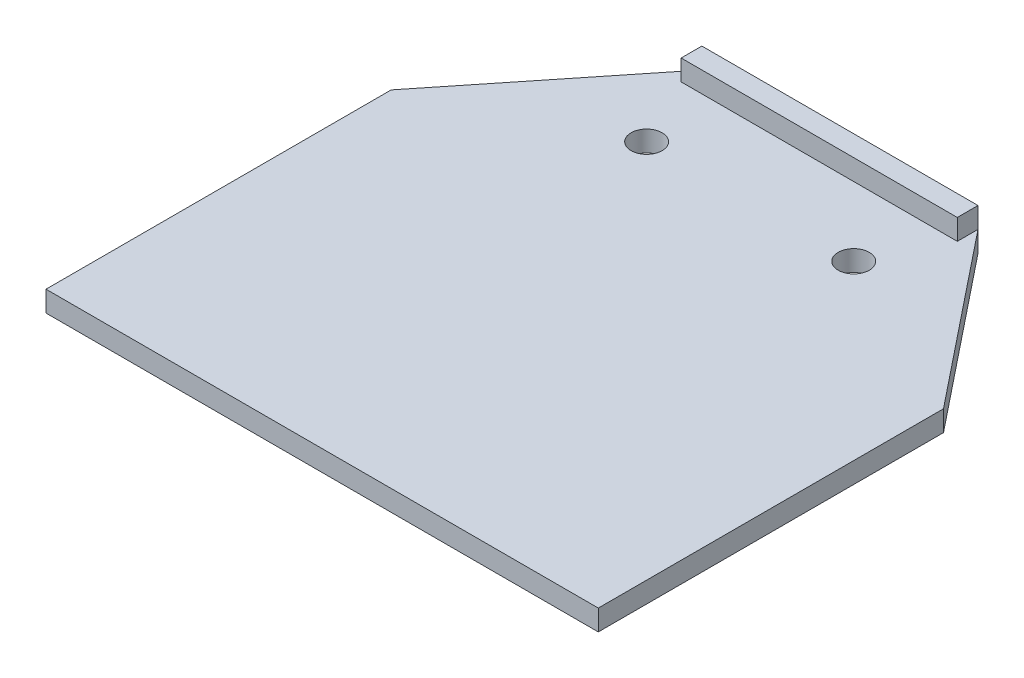
ISO-10303-21;
HEADER;
FILE_DESCRIPTION(('STEP AP214'),'2;1');
FILE_NAME('part.step','',(''),(''),'','','');
FILE_SCHEMA(('AUTOMOTIVE_DESIGN { 1 0 10303 214 1 1 1 1 }'));
ENDSEC;
DATA;
#1=APPLICATION_CONTEXT('core data for automotive mechanical design processes');
#2=APPLICATION_PROTOCOL_DEFINITION('international standard','automotive_design',2000,#1);
#3=PRODUCT_CONTEXT('',#1,'mechanical');
#4=PRODUCT('Part','Part','',(#3));
#5=PRODUCT_RELATED_PRODUCT_CATEGORY('part','',(#4));
#6=PRODUCT_DEFINITION_FORMATION('','',#4);
#7=PRODUCT_DEFINITION_CONTEXT('part definition',#1,'design');
#8=PRODUCT_DEFINITION('design','',#6,#7);
#9=PRODUCT_DEFINITION_SHAPE('','',#8);
#10=(LENGTH_UNIT() NAMED_UNIT(*) SI_UNIT(.MILLI.,.METRE.));
#11=(NAMED_UNIT(*) PLANE_ANGLE_UNIT() SI_UNIT($,.RADIAN.));
#12=(NAMED_UNIT(*) SI_UNIT($,.STERADIAN.) SOLID_ANGLE_UNIT());
#13=UNCERTAINTY_MEASURE_WITH_UNIT(LENGTH_MEASURE(1.E-05),#10,'distance_accuracy_value','');
#14=(GEOMETRIC_REPRESENTATION_CONTEXT(3) GLOBAL_UNCERTAINTY_ASSIGNED_CONTEXT((#13)) GLOBAL_UNIT_ASSIGNED_CONTEXT((#10,
#11,#12)) REPRESENTATION_CONTEXT('',''));
#15=CARTESIAN_POINT('',(0.,0.,0.));
#16=DIRECTION('',(0.,0.,1.));
#17=DIRECTION('',(1.,0.,0.));
#18=AXIS2_PLACEMENT_3D('',#15,#16,#17);
#19=CARTESIAN_POINT('',(-35.71281292086,25.,-150.0000000003));
#20=DIRECTION('',(-0.780868809443226,0.,-0.62469504755418));
#21=DIRECTION('',(-0.62469504755418,0.,0.780868809443226));
#22=AXIS2_PLACEMENT_3D('',#19,#20,#21);
#23=PLANE('',#22);
#24=DIRECTION('',(-0.62469504755418,0.,0.780868809443226));
#25=VECTOR('',#24,1.);
#26=CARTESIAN_POINT('',(-35.71281292086,25.,-150.0000000003));
#27=LINE('',#26,#25);
#28=CARTESIAN_POINT('',(-35.71281292086,25.,-150.0000000003));
#29=VERTEX_POINT('',#28);
#30=CARTESIAN_POINT('',(-75.71281292094,25.,-99.99999999991));
#31=VERTEX_POINT('',#30);
#32=EDGE_CURVE('E243',#29,#31,#27,.T.);
#33=ORIENTED_EDGE('',*,*,#32,.T.);
#34=DIRECTION('',(0.,1.,0.));
#35=VECTOR('',#34,1.);
#36=CARTESIAN_POINT('',(-75.71281292094,25.,-99.99999999991));
#37=LINE('',#36,#35);
#38=CARTESIAN_POINT('',(-75.71281292094,31.,-99.99999999991));
#39=VERTEX_POINT('',#38);
#40=EDGE_CURVE('E241',#31,#39,#37,.T.);
#41=ORIENTED_EDGE('',*,*,#40,.T.);
#42=DIRECTION('',(-0.62469504755418,0.,0.780868809443226));
#43=VECTOR('',#42,1.);
#44=CARTESIAN_POINT('',(-35.71281292086,31.,-150.0000000003));
#45=LINE('',#44,#43);
#46=CARTESIAN_POINT('',(-35.71281292086,31.,-150.0000000003));
#47=VERTEX_POINT('',#46);
#48=EDGE_CURVE('E11',#47,#39,#45,.T.);
#49=ORIENTED_EDGE('',*,*,#48,.F.);
#50=DIRECTION('',(0.,1.,0.));
#51=VECTOR('',#50,1.);
#52=CARTESIAN_POINT('',(-35.71281292086,25.,-150.0000000003));
#53=LINE('',#52,#51);
#54=EDGE_CURVE('E130',#29,#47,#53,.T.);
#55=ORIENTED_EDGE('',*,*,#54,.F.);
#56=EDGE_LOOP('',(#33,#41,#49,#55));
#57=FACE_BOUND('',#56,.T.);
#58=ADVANCED_FACE('F17',(#57),#23,.T.);
#59=CARTESIAN_POINT('',(4.287187079,31.,-87.70969277747));
#60=DIRECTION('',(0.,-1.,0.));
#61=DIRECTION('',(-1.,0.,0.));
#62=AXIS2_PLACEMENT_3D('',#59,#60,#61);
#63=PLANE('',#62);
#64=CARTESIAN_POINT('',(34.287187078966,31.,-123.9999999997));
#65=DIRECTION('',(0.,1.,0.));
#66=DIRECTION('',(1.,0.,-4.806710585115E-13));
#67=AXIS2_PLACEMENT_3D('',#64,#65,#66);
#68=CIRCLE('',#67,4.5);
#69=CARTESIAN_POINT('',(38.787187078975,31.,-123.9999999997));
#70=VERTEX_POINT('',#69);
#71=EDGE_CURVE('E117',#70,#70,#68,.T.);
#72=ORIENTED_EDGE('',*,*,#71,.F.);
#73=EDGE_LOOP('',(#72));
#74=FACE_BOUND('',#73,.T.);
#75=CARTESIAN_POINT('',(-25.71281292095,31.,-123.9999999998));
#76=DIRECTION('',(0.,1.,0.));
#77=DIRECTION('',(1.,0.,-4.806710585115E-13));
#78=AXIS2_PLACEMENT_3D('',#75,#76,#77);
#79=CIRCLE('',#78,4.5);
#80=CARTESIAN_POINT('',(-21.21281292094,31.,-123.9999999998));
#81=VERTEX_POINT('',#80);
#82=EDGE_CURVE('E126',#81,#81,#79,.T.);
#83=ORIENTED_EDGE('',*,*,#82,.F.);
#84=EDGE_LOOP('',(#83));
#85=FACE_BOUND('',#84,.T.);
#86=ORIENTED_EDGE('',*,*,#48,.T.);
#87=DIRECTION('',(4.806710585115E-13,0.,1.));
#88=VECTOR('',#87,1.);
#89=CARTESIAN_POINT('',(-75.71281292094,31.,-99.99999999991));
#90=LINE('',#89,#88);
#91=CARTESIAN_POINT('',(-75.71281292092,31.,-70.));
#92=VERTEX_POINT('',#91);
#93=EDGE_CURVE('E238',#39,#92,#90,.T.);
#94=ORIENTED_EDGE('',*,*,#93,.T.);
#95=DIRECTION('',(3.591571484662E-13,0.,1.));
#96=VECTOR('',#95,1.);
#97=CARTESIAN_POINT('',(-75.71281292092,31.,-70.));
#98=LINE('',#97,#96);
#99=CARTESIAN_POINT('',(-75.7128129209,31.,-2.605702320579E-10));
#100=VERTEX_POINT('',#99);
#101=EDGE_CURVE('E251',#92,#100,#98,.T.);
#102=ORIENTED_EDGE('',*,*,#101,.T.);
#103=DIRECTION('',(1.,0.,-4.806710585115E-13));
#104=VECTOR('',#103,1.);
#105=CARTESIAN_POINT('',(-75.7128129209,31.,-2.596607373562E-10));
#106=LINE('',#105,#104);
#107=CARTESIAN_POINT('',(84.28718707904,31.,1.423359208275E-10));
#108=VERTEX_POINT('',#107);
#109=EDGE_CURVE('E28',#100,#108,#106,.T.);
#110=ORIENTED_EDGE('',*,*,#109,.T.);
#111=DIRECTION('',(1.361966095459E-12,0.,1.));
#112=VECTOR('',#111,1.);
#113=CARTESIAN_POINT('',(84.287187078904,31.,-99.99999999953));
#114=LINE('',#113,#112);
#115=CARTESIAN_POINT('',(84.287187078904,31.,-99.99999999953));
#116=VERTEX_POINT('',#115);
#117=EDGE_CURVE('E21',#116,#108,#114,.T.);
#118=ORIENTED_EDGE('',*,*,#117,.F.);
#119=DIRECTION('',(-0.62469504755479,0.,-0.780868809442738));
#120=VECTOR('',#119,1.);
#121=CARTESIAN_POINT('',(84.287187078904,31.,-99.99999999953));
#122=LINE('',#121,#120);
#123=CARTESIAN_POINT('',(44.287187079157,31.,-150.0000000001));
#124=VERTEX_POINT('',#123);
#125=EDGE_CURVE('E150',#116,#124,#122,.T.);
#126=ORIENTED_EDGE('',*,*,#125,.T.);
#127=DIRECTION('',(4.806710585115E-13,0.,1.));
#128=VECTOR('',#127,1.);
#129=CARTESIAN_POINT('',(44.287187079157,31.,-150.0000000001));
#130=LINE('',#129,#128);
#131=CARTESIAN_POINT('',(44.287187079074,31.,-143.9999999998));
#132=VERTEX_POINT('',#131);
#133=EDGE_CURVE('E83',#124,#132,#130,.T.);
#134=ORIENTED_EDGE('',*,*,#133,.T.);
#135=DIRECTION('',(1.,0.,-4.806710585115E-13));
#136=VECTOR('',#135,1.);
#137=CARTESIAN_POINT('',(-35.71281292094,31.,-144.0000000001));
#138=LINE('',#137,#136);
#139=CARTESIAN_POINT('',(-35.71281292094,31.,-144.0000000001));
#140=VERTEX_POINT('',#139);
#141=EDGE_CURVE('E96',#140,#132,#138,.T.);
#142=ORIENTED_EDGE('',*,*,#141,.F.);
#143=DIRECTION('',(4.806710585115E-13,0.,1.));
#144=VECTOR('',#143,1.);
#145=CARTESIAN_POINT('',(-35.71281292086,31.,-150.0000000003));
#146=LINE('',#145,#144);
#147=EDGE_CURVE('E115',#47,#140,#146,.T.);
#148=ORIENTED_EDGE('',*,*,#147,.F.);
#149=EDGE_LOOP('',(#86,#94,#102,#110,#118,#126,#134,#142,#148));
#150=FACE_BOUND('',#149,.T.);
#151=ADVANCED_FACE('F167',(#74,#85,#150),#63,.F.);
#152=CARTESIAN_POINT('',(-75.7128129209,25.,-2.596607373562E-10));
#153=DIRECTION('',(4.806710585115E-13,0.,1.));
#154=DIRECTION('',(1.,0.,-4.806710585115E-13));
#155=AXIS2_PLACEMENT_3D('',#152,#153,#154);
#156=PLANE('',#155);
#157=DIRECTION('',(1.,0.,-4.806710585115E-13));
#158=VECTOR('',#157,1.);
#159=CARTESIAN_POINT('',(-75.7128129209,25.,-2.596607373562E-10));
#160=LINE('',#159,#158);
#161=CARTESIAN_POINT('',(-75.7128129209,25.,-2.605702320579E-10));
#162=VERTEX_POINT('',#161);
#163=CARTESIAN_POINT('',(84.28718707904,25.,1.423359208275E-10));
#164=VERTEX_POINT('',#163);
#165=EDGE_CURVE('E112',#162,#164,#160,.T.);
#166=ORIENTED_EDGE('',*,*,#165,.T.);
#167=DIRECTION('',(0.,1.,0.));
#168=VECTOR('',#167,1.);
#169=CARTESIAN_POINT('',(84.28718707904,25.,1.418811734766E-10));
#170=LINE('',#169,#168);
#171=EDGE_CURVE('E123',#164,#108,#170,.T.);
#172=ORIENTED_EDGE('',*,*,#171,.T.);
#173=ORIENTED_EDGE('',*,*,#109,.F.);
#174=DIRECTION('',(0.,1.,0.));
#175=VECTOR('',#174,1.);
#176=CARTESIAN_POINT('',(-75.7128129209,25.,-2.596607373562E-10));
#177=LINE('',#176,#175);
#178=EDGE_CURVE('E256',#162,#100,#177,.T.);
#179=ORIENTED_EDGE('',*,*,#178,.F.);
#180=EDGE_LOOP('',(#166,#172,#173,#179));
#181=FACE_BOUND('',#180,.T.);
#182=ADVANCED_FACE('F292',(#181),#156,.T.);
#183=CARTESIAN_POINT('',(84.28718707904,25.,-39.99999999985));
#184=DIRECTION('',(1.,0.,-4.806988140871E-13));
#185=DIRECTION('',(-4.806988140871E-13,0.,-1.));
#186=AXIS2_PLACEMENT_3D('',#183,#184,#185);
#187=PLANE('',#186);
#188=DIRECTION('',(0.,1.,0.));
#189=VECTOR('',#188,1.);
#190=CARTESIAN_POINT('',(84.287187078904,25.,-99.99999999953));
#191=LINE('',#190,#189);
#192=CARTESIAN_POINT('',(84.287187078904,25.,-99.99999999953));
#193=VERTEX_POINT('',#192);
#194=EDGE_CURVE('E152',#193,#116,#191,.T.);
#195=ORIENTED_EDGE('',*,*,#194,.T.);
#196=ORIENTED_EDGE('',*,*,#117,.T.);
#197=ORIENTED_EDGE('',*,*,#171,.F.);
#198=DIRECTION('',(-1.361966095459E-12,0.,-1.));
#199=VECTOR('',#198,1.);
#200=CARTESIAN_POINT('',(84.28718707904,25.,1.419948603143E-10));
#201=LINE('',#200,#199);
#202=EDGE_CURVE('E271',#164,#193,#201,.T.);
#203=ORIENTED_EDGE('',*,*,#202,.T.);
#204=EDGE_LOOP('',(#195,#196,#197,#203));
#205=FACE_BOUND('',#204,.T.);
#206=ADVANCED_FACE('F19',(#205),#187,.T.);
#207=CARTESIAN_POINT('',(84.287187078904,25.,-99.99999999953));
#208=DIRECTION('',(0.780868809442738,0.,-0.62469504755479));
#209=DIRECTION('',(0.,-1.,0.));
#210=AXIS2_PLACEMENT_3D('',#207,#208,#209);
#211=PLANE('',#210);
#212=DIRECTION('',(-0.62469504755479,0.,-0.780868809442738));
#213=VECTOR('',#212,1.);
#214=CARTESIAN_POINT('',(84.287187078904,25.,-99.99999999953));
#215=LINE('',#214,#213);
#216=CARTESIAN_POINT('',(44.287187079157,25.,-150.0000000001));
#217=VERTEX_POINT('',#216);
#218=EDGE_CURVE('E174',#193,#217,#215,.T.);
#219=ORIENTED_EDGE('',*,*,#218,.T.);
#220=DIRECTION('',(0.,1.,0.));
#221=VECTOR('',#220,1.);
#222=CARTESIAN_POINT('',(44.287187079157,25.,-150.0000000001));
#223=LINE('',#222,#221);
#224=EDGE_CURVE('E116',#217,#124,#223,.T.);
#225=ORIENTED_EDGE('',*,*,#224,.T.);
#226=ORIENTED_EDGE('',*,*,#125,.F.);
#227=ORIENTED_EDGE('',*,*,#194,.F.);
#228=EDGE_LOOP('',(#219,#225,#226,#227));
#229=FACE_BOUND('',#228,.T.);
#230=ADVANCED_FACE('F171',(#229),#211,.T.);
#231=CARTESIAN_POINT('',(44.287187079157,37.,-150.0000000001));
#232=DIRECTION('',(1.,0.,-4.806710585115E-13));
#233=DIRECTION('',(-4.806710585115E-13,0.,-1.));
#234=AXIS2_PLACEMENT_3D('',#231,#232,#233);
#235=PLANE('',#234);
#236=DIRECTION('',(0.,-1.,0.));
#237=VECTOR('',#236,1.);
#238=CARTESIAN_POINT('',(44.287187079074,37.,-143.9999999998));
#239=LINE('',#238,#237);
#240=CARTESIAN_POINT('',(44.287187079074,37.,-143.9999999998));
#241=VERTEX_POINT('',#240);
#242=EDGE_CURVE('E75',#241,#132,#239,.T.);
#243=ORIENTED_EDGE('',*,*,#242,.T.);
#244=ORIENTED_EDGE('',*,*,#133,.F.);
#245=DIRECTION('',(0.,-1.,0.));
#246=VECTOR('',#245,1.);
#247=CARTESIAN_POINT('',(44.287187079157,37.,-150.0000000001));
#248=LINE('',#247,#246);
#249=CARTESIAN_POINT('',(44.287187079157,37.,-150.0000000001));
#250=VERTEX_POINT('',#249);
#251=EDGE_CURVE('E78',#250,#124,#248,.T.);
#252=ORIENTED_EDGE('',*,*,#251,.F.);
#253=DIRECTION('',(4.806710585115E-13,0.,1.));
#254=VECTOR('',#253,1.);
#255=CARTESIAN_POINT('',(44.287187079157,37.,-150.0000000001));
#256=LINE('',#255,#254);
#257=EDGE_CURVE('E70',#250,#241,#256,.T.);
#258=ORIENTED_EDGE('',*,*,#257,.T.);
#259=EDGE_LOOP('',(#243,#244,#252,#258));
#260=FACE_BOUND('',#259,.T.);
#261=ADVANCED_FACE('F72',(#260),#235,.T.);
#262=CARTESIAN_POINT('',(-35.71281292086,37.,-150.0000000003));
#263=DIRECTION('',(0.,-1.,0.));
#264=DIRECTION('',(-1.,0.,0.));
#265=AXIS2_PLACEMENT_3D('',#262,#263,#264);
#266=PLANE('',#265);
#267=DIRECTION('',(1.,0.,-4.806710585115E-13));
#268=VECTOR('',#267,1.);
#269=CARTESIAN_POINT('',(-35.71281292086,37.,-150.0000000003));
#270=LINE('',#269,#268);
#271=CARTESIAN_POINT('',(-35.71281292086,37.,-150.0000000003));
#272=VERTEX_POINT('',#271);
#273=EDGE_CURVE('E135',#272,#250,#270,.T.);
#274=ORIENTED_EDGE('',*,*,#273,.F.);
#275=DIRECTION('',(4.806710585115E-13,0.,1.));
#276=VECTOR('',#275,1.);
#277=CARTESIAN_POINT('',(-35.71281292086,37.,-150.0000000003));
#278=LINE('',#277,#276);
#279=CARTESIAN_POINT('',(-35.71281292094,37.,-144.0000000001));
#280=VERTEX_POINT('',#279);
#281=EDGE_CURVE('E89',#272,#280,#278,.T.);
#282=ORIENTED_EDGE('',*,*,#281,.T.);
#283=DIRECTION('',(1.,0.,-4.806710585115E-13));
#284=VECTOR('',#283,1.);
#285=CARTESIAN_POINT('',(-35.71281292094,37.,-144.0000000001));
#286=LINE('',#285,#284);
#287=EDGE_CURVE('E84',#280,#241,#286,.T.);
#288=ORIENTED_EDGE('',*,*,#287,.T.);
#289=ORIENTED_EDGE('',*,*,#257,.F.);
#290=EDGE_LOOP('',(#274,#282,#288,#289));
#291=FACE_BOUND('',#290,.T.);
#292=ADVANCED_FACE('F87',(#291),#266,.F.);
#293=CARTESIAN_POINT('',(-35.71281292094,37.,-144.0000000001));
#294=DIRECTION('',(4.806710585115E-13,0.,1.));
#295=DIRECTION('',(1.,0.,-4.806710585115E-13));
#296=AXIS2_PLACEMENT_3D('',#293,#294,#295);
#297=PLANE('',#296);
#298=ORIENTED_EDGE('',*,*,#141,.T.);
#299=ORIENTED_EDGE('',*,*,#242,.F.);
#300=ORIENTED_EDGE('',*,*,#287,.F.);
#301=DIRECTION('',(0.,-1.,0.));
#302=VECTOR('',#301,1.);
#303=CARTESIAN_POINT('',(-35.71281292094,37.,-144.0000000001));
#304=LINE('',#303,#302);
#305=EDGE_CURVE('E103',#280,#140,#304,.T.);
#306=ORIENTED_EDGE('',*,*,#305,.T.);
#307=EDGE_LOOP('',(#298,#299,#300,#306));
#308=FACE_BOUND('',#307,.T.);
#309=ADVANCED_FACE('F95',(#308),#297,.T.);
#310=CARTESIAN_POINT('',(-35.71281292086,37.,-150.0000000003));
#311=DIRECTION('',(1.,0.,-4.806710585115E-13));
#312=DIRECTION('',(-4.806710585115E-13,0.,-1.));
#313=AXIS2_PLACEMENT_3D('',#310,#311,#312);
#314=PLANE('',#313);
#315=ORIENTED_EDGE('',*,*,#281,.F.);
#316=DIRECTION('',(0.,-1.,0.));
#317=VECTOR('',#316,1.);
#318=CARTESIAN_POINT('',(-35.71281292086,37.,-150.0000000003));
#319=LINE('',#318,#317);
#320=EDGE_CURVE('E134',#272,#47,#319,.T.);
#321=ORIENTED_EDGE('',*,*,#320,.T.);
#322=ORIENTED_EDGE('',*,*,#147,.T.);
#323=ORIENTED_EDGE('',*,*,#305,.F.);
#324=EDGE_LOOP('',(#315,#321,#322,#323));
#325=FACE_BOUND('',#324,.T.);
#326=ADVANCED_FACE('F321',(#325),#314,.F.);
#327=CARTESIAN_POINT('',(44.287187079157,25.,-150.0000000001));
#328=DIRECTION('',(-4.806710585115E-13,0.,-1.));
#329=DIRECTION('',(-1.,0.,4.806710585115E-13));
#330=AXIS2_PLACEMENT_3D('',#327,#328,#329);
#331=PLANE('',#330);
#332=DIRECTION('',(-1.,0.,4.806710585115E-13));
#333=VECTOR('',#332,1.);
#334=CARTESIAN_POINT('',(44.287187079157,25.,-150.0000000001));
#335=LINE('',#334,#333);
#336=EDGE_CURVE('E264',#217,#29,#335,.T.);
#337=ORIENTED_EDGE('',*,*,#336,.T.);
#338=ORIENTED_EDGE('',*,*,#54,.T.);
#339=ORIENTED_EDGE('',*,*,#320,.F.);
#340=ORIENTED_EDGE('',*,*,#273,.T.);
#341=ORIENTED_EDGE('',*,*,#251,.T.);
#342=ORIENTED_EDGE('',*,*,#224,.F.);
#343=EDGE_LOOP('',(#337,#338,#339,#340,#341,#342));
#344=FACE_BOUND('',#343,.T.);
#345=ADVANCED_FACE('F178',(#344),#331,.T.);
#346=CARTESIAN_POINT('',(-25.71281292095,24.99,-123.9999999998));
#347=DIRECTION('',(0.,-1.,0.));
#348=DIRECTION('',(1.,0.,-4.806710585115E-13));
#349=AXIS2_PLACEMENT_3D('',#346,#347,#348);
#350=CYLINDRICAL_SURFACE('',#349,4.5);
#351=DIRECTION('',(0.,1.,0.));
#352=VECTOR('',#351,1.);
#353=CARTESIAN_POINT('',(-21.21281292094,24.99,-123.9999999998));
#354=LINE('',#353,#352);
#355=CARTESIAN_POINT('',(-21.21281292094,25.,-123.9999999998));
#356=VERTEX_POINT('',#355);
#357=EDGE_CURVE('E121',#356,#81,#354,.T.);
#358=ORIENTED_EDGE('',*,*,#357,.T.);
#359=ORIENTED_EDGE('',*,*,#82,.T.);
#360=ORIENTED_EDGE('',*,*,#357,.F.);
#361=CARTESIAN_POINT('',(-25.71281292095,25.,-123.9999999998));
#362=DIRECTION('',(0.,1.,0.));
#363=DIRECTION('',(1.,0.,-4.806710585115E-13));
#364=AXIS2_PLACEMENT_3D('',#361,#362,#363);
#365=CIRCLE('',#364,4.5);
#366=EDGE_CURVE('E108',#356,#356,#365,.T.);
#367=ORIENTED_EDGE('',*,*,#366,.F.);
#368=EDGE_LOOP('',(#358,#359,#360,#367));
#369=FACE_BOUND('',#368,.T.);
#370=ADVANCED_FACE('F316',(#369),#350,.F.);
#371=CARTESIAN_POINT('',(34.287187078966,24.99,-123.9999999997));
#372=DIRECTION('',(0.,-1.,0.));
#373=DIRECTION('',(1.,0.,-4.806710585115E-13));
#374=AXIS2_PLACEMENT_3D('',#371,#372,#373);
#375=CYLINDRICAL_SURFACE('',#374,4.5);
#376=DIRECTION('',(0.,1.,0.));
#377=VECTOR('',#376,1.);
#378=CARTESIAN_POINT('',(38.787187078975,24.99,-123.9999999997));
#379=LINE('',#378,#377);
#380=CARTESIAN_POINT('',(38.787187078975,25.,-123.9999999997));
#381=VERTEX_POINT('',#380);
#382=EDGE_CURVE('E122',#381,#70,#379,.T.);
#383=ORIENTED_EDGE('',*,*,#382,.T.);
#384=ORIENTED_EDGE('',*,*,#71,.T.);
#385=ORIENTED_EDGE('',*,*,#382,.F.);
#386=CARTESIAN_POINT('',(34.287187078966,25.,-123.9999999997));
#387=DIRECTION('',(0.,1.,0.));
#388=DIRECTION('',(1.,0.,-4.806710585115E-13));
#389=AXIS2_PLACEMENT_3D('',#386,#387,#388);
#390=CIRCLE('',#389,4.5);
#391=EDGE_CURVE('E111',#381,#381,#390,.T.);
#392=ORIENTED_EDGE('',*,*,#391,.F.);
#393=EDGE_LOOP('',(#383,#384,#385,#392));
#394=FACE_BOUND('',#393,.T.);
#395=ADVANCED_FACE('F314',(#394),#375,.F.);
#396=CARTESIAN_POINT('',(4.287187079,25.,-87.70969277747));
#397=DIRECTION('',(0.,-1.,0.));
#398=DIRECTION('',(-1.,0.,0.));
#399=AXIS2_PLACEMENT_3D('',#396,#397,#398);
#400=PLANE('',#399);
#401=ORIENTED_EDGE('',*,*,#391,.T.);
#402=EDGE_LOOP('',(#401));
#403=FACE_BOUND('',#402,.T.);
#404=ORIENTED_EDGE('',*,*,#366,.T.);
#405=EDGE_LOOP('',(#404));
#406=FACE_BOUND('',#405,.T.);
#407=ORIENTED_EDGE('',*,*,#32,.F.);
#408=ORIENTED_EDGE('',*,*,#336,.F.);
#409=ORIENTED_EDGE('',*,*,#218,.F.);
#410=ORIENTED_EDGE('',*,*,#202,.F.);
#411=ORIENTED_EDGE('',*,*,#165,.F.);
#412=DIRECTION('',(-3.956279748252E-13,0.,-1.));
#413=VECTOR('',#412,1.);
#414=CARTESIAN_POINT('',(-75.7128129209,25.,-2.604565452202E-10));
#415=LINE('',#414,#413);
#416=EDGE_CURVE('E287',#162,#31,#415,.T.);
#417=ORIENTED_EDGE('',*,*,#416,.T.);
#418=EDGE_LOOP('',(#407,#408,#409,#410,#411,#417));
#419=FACE_BOUND('',#418,.T.);
#420=ADVANCED_FACE('F279',(#403,#406,#419),#400,.T.);
#421=CARTESIAN_POINT('',(-75.71281292094,25.,-99.99999999991));
#422=DIRECTION('',(-1.,0.,4.806988140871E-13));
#423=DIRECTION('',(0.,1.,0.));
#424=AXIS2_PLACEMENT_3D('',#421,#422,#423);
#425=PLANE('',#424);
#426=ORIENTED_EDGE('',*,*,#416,.F.);
#427=ORIENTED_EDGE('',*,*,#178,.T.);
#428=ORIENTED_EDGE('',*,*,#101,.F.);
#429=ORIENTED_EDGE('',*,*,#93,.F.);
#430=ORIENTED_EDGE('',*,*,#40,.F.);
#431=EDGE_LOOP('',(#426,#427,#428,#429,#430));
#432=FACE_BOUND('',#431,.T.);
#433=ADVANCED_FACE('F249',(#432),#425,.T.);
#434=CLOSED_SHELL('',(#58,#151,#182,#206,#230,#261,#292,#309,#326,#345,#370,#395,#420,#433));
#435=MANIFOLD_SOLID_BREP('B1',#434);
#436=ADVANCED_BREP_SHAPE_REPRESENTATION('',(#18,#435),#14);
#437=SHAPE_DEFINITION_REPRESENTATION(#9,#436);
ENDSEC;
END-ISO-10303-21;
